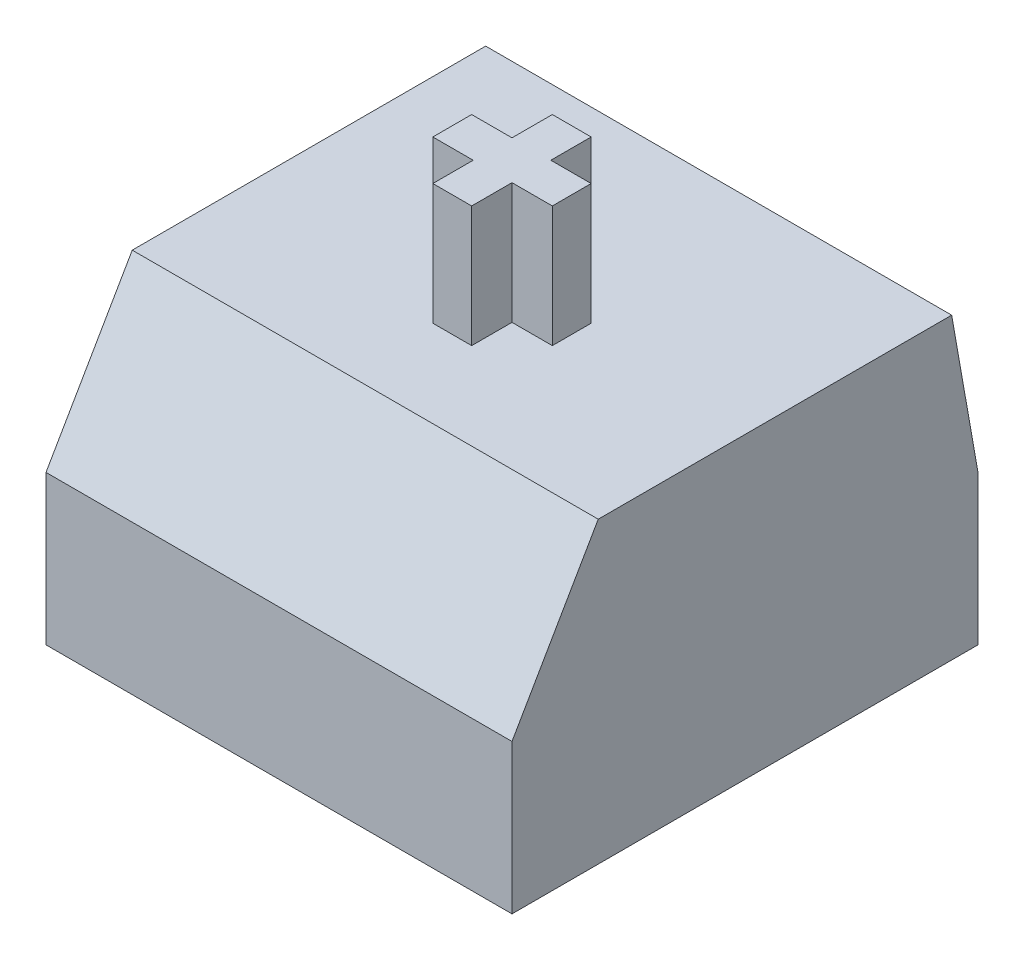
ISO-10303-21;
HEADER;
FILE_DESCRIPTION(('STEP AP214'),'2;1');
FILE_NAME('part.step','',(''),(''),'','','');
FILE_SCHEMA(('AUTOMOTIVE_DESIGN { 1 0 10303 214 1 1 1 1 }'));
ENDSEC;
DATA;
#1=APPLICATION_CONTEXT('core data for automotive mechanical design processes');
#2=APPLICATION_PROTOCOL_DEFINITION('international standard','automotive_design',2000,#1);
#3=PRODUCT_CONTEXT('',#1,'mechanical');
#4=PRODUCT('Part','Part','',(#3));
#5=PRODUCT_RELATED_PRODUCT_CATEGORY('part','',(#4));
#6=PRODUCT_DEFINITION_FORMATION('','',#4);
#7=PRODUCT_DEFINITION_CONTEXT('part definition',#1,'design');
#8=PRODUCT_DEFINITION('design','',#6,#7);
#9=PRODUCT_DEFINITION_SHAPE('','',#8);
#10=(LENGTH_UNIT() NAMED_UNIT(*) SI_UNIT(.MILLI.,.METRE.));
#11=(NAMED_UNIT(*) PLANE_ANGLE_UNIT() SI_UNIT($,.RADIAN.));
#12=(NAMED_UNIT(*) SI_UNIT($,.STERADIAN.) SOLID_ANGLE_UNIT());
#13=UNCERTAINTY_MEASURE_WITH_UNIT(LENGTH_MEASURE(1.E-05),#10,'distance_accuracy_value','');
#14=(GEOMETRIC_REPRESENTATION_CONTEXT(3) GLOBAL_UNCERTAINTY_ASSIGNED_CONTEXT((#13)) GLOBAL_UNIT_ASSIGNED_CONTEXT((#10,
#11,#12)) REPRESENTATION_CONTEXT('',''));
#15=CARTESIAN_POINT('',(0.,0.,0.));
#16=DIRECTION('',(0.,0.,1.));
#17=DIRECTION('',(1.,0.,0.));
#18=AXIS2_PLACEMENT_3D('',#15,#16,#17);
#19=CARTESIAN_POINT('',(7.8,10.,-6.91836509645765));
#20=DIRECTION('',(0.,-1.,0.));
#21=DIRECTION('',(0.,0.,-1.));
#22=AXIS2_PLACEMENT_3D('',#19,#20,#21);
#23=PLANE('',#22);
#24=DIRECTION('',(0.,0.,1.));
#25=VECTOR('',#24,1.);
#26=CARTESIAN_POINT('',(-7.8,10.,-6.91836509645765));
#27=LINE('',#26,#25);
#28=CARTESIAN_POINT('',(-7.8,10.,-6.91836509645765));
#29=VERTEX_POINT('',#28);
#30=CARTESIAN_POINT('',(-7.8,10.,4.91324865405184));
#31=VERTEX_POINT('',#30);
#32=EDGE_CURVE('E193',#29,#31,#27,.T.);
#33=ORIENTED_EDGE('',*,*,#32,.T.);
#34=DIRECTION('',(-1.,0.,0.));
#35=VECTOR('',#34,1.);
#36=CARTESIAN_POINT('',(7.8,10.,4.91324865405184));
#37=LINE('',#36,#35);
#38=CARTESIAN_POINT('',(7.8,10.,4.91324865405184));
#39=VERTEX_POINT('',#38);
#40=EDGE_CURVE('E225',#39,#31,#37,.T.);
#41=ORIENTED_EDGE('',*,*,#40,.F.);
#42=DIRECTION('',(0.,0.,1.));
#43=VECTOR('',#42,1.);
#44=CARTESIAN_POINT('',(7.8,10.,-6.91836509645765));
#45=LINE('',#44,#43);
#46=CARTESIAN_POINT('',(7.8,10.,-6.91836509645765));
#47=VERTEX_POINT('',#46);
#48=EDGE_CURVE('E204',#47,#39,#45,.T.);
#49=ORIENTED_EDGE('',*,*,#48,.F.);
#50=DIRECTION('',(-1.,0.,0.));
#51=VECTOR('',#50,1.);
#52=CARTESIAN_POINT('',(7.8,10.,-6.91836509645765));
#53=LINE('',#52,#51);
#54=EDGE_CURVE('E215',#47,#29,#53,.T.);
#55=ORIENTED_EDGE('',*,*,#54,.T.);
#56=EDGE_LOOP('',(#33,#41,#49,#55));
#57=FACE_BOUND('',#56,.T.);
#58=DIRECTION('',(0.,0.,1.));
#59=VECTOR('',#58,1.);
#60=CARTESIAN_POINT('',(-0.65,10.,-0.649999999999998));
#61=LINE('',#60,#59);
#62=CARTESIAN_POINT('',(-0.65,10.,-2.));
#63=VERTEX_POINT('',#62);
#64=CARTESIAN_POINT('',(-0.65,10.,-0.649999999999999));
#65=VERTEX_POINT('',#64);
#66=EDGE_CURVE('E191',#63,#65,#61,.T.);
#67=ORIENTED_EDGE('',*,*,#66,.F.);
#68=DIRECTION('',(-1.,0.,0.));
#69=VECTOR('',#68,1.);
#70=CARTESIAN_POINT('',(-0.65,10.,-2.));
#71=LINE('',#70,#69);
#72=CARTESIAN_POINT('',(0.65,10.,-2.));
#73=VERTEX_POINT('',#72);
#74=EDGE_CURVE('E188',#73,#63,#71,.T.);
#75=ORIENTED_EDGE('',*,*,#74,.F.);
#76=DIRECTION('',(0.,0.,-1.));
#77=VECTOR('',#76,1.);
#78=CARTESIAN_POINT('',(0.65,10.,-2.));
#79=LINE('',#78,#77);
#80=CARTESIAN_POINT('',(0.65,10.,-0.649999999999998));
#81=VERTEX_POINT('',#80);
#82=EDGE_CURVE('E680',#81,#73,#79,.T.);
#83=ORIENTED_EDGE('',*,*,#82,.F.);
#84=DIRECTION('',(-1.,0.,0.));
#85=VECTOR('',#84,1.);
#86=CARTESIAN_POINT('',(0.650000000000001,10.,-0.649999999999999));
#87=LINE('',#86,#85);
#88=CARTESIAN_POINT('',(2.,10.,-0.649999999999998));
#89=VERTEX_POINT('',#88);
#90=EDGE_CURVE('E676',#89,#81,#87,.T.);
#91=ORIENTED_EDGE('',*,*,#90,.F.);
#92=DIRECTION('',(0.,0.,-1.));
#93=VECTOR('',#92,1.);
#94=CARTESIAN_POINT('',(2.,10.,-0.649999999999998));
#95=LINE('',#94,#93);
#96=CARTESIAN_POINT('',(2.,10.,0.650000000000003));
#97=VERTEX_POINT('',#96);
#98=EDGE_CURVE('E672',#97,#89,#95,.T.);
#99=ORIENTED_EDGE('',*,*,#98,.F.);
#100=DIRECTION('',(1.,0.,0.));
#101=VECTOR('',#100,1.);
#102=CARTESIAN_POINT('',(2.,10.,0.650000000000002));
#103=LINE('',#102,#101);
#104=CARTESIAN_POINT('',(0.650000000000001,10.,0.650000000000002));
#105=VERTEX_POINT('',#104);
#106=EDGE_CURVE('E668',#105,#97,#103,.T.);
#107=ORIENTED_EDGE('',*,*,#106,.F.);
#108=DIRECTION('',(0.,0.,-1.));
#109=VECTOR('',#108,1.);
#110=CARTESIAN_POINT('',(0.650000000000001,10.,0.650000000000002));
#111=LINE('',#110,#109);
#112=CARTESIAN_POINT('',(0.650000000000002,10.,2.));
#113=VERTEX_POINT('',#112);
#114=EDGE_CURVE('E664',#113,#105,#111,.T.);
#115=ORIENTED_EDGE('',*,*,#114,.F.);
#116=DIRECTION('',(1.,0.,0.));
#117=VECTOR('',#116,1.);
#118=CARTESIAN_POINT('',(0.650000000000002,10.,2.));
#119=LINE('',#118,#117);
#120=CARTESIAN_POINT('',(-0.65,10.,2.));
#121=VERTEX_POINT('',#120);
#122=EDGE_CURVE('E660',#121,#113,#119,.T.);
#123=ORIENTED_EDGE('',*,*,#122,.F.);
#124=DIRECTION('',(0.,0.,1.));
#125=VECTOR('',#124,1.);
#126=CARTESIAN_POINT('',(-0.65,10.,2.));
#127=LINE('',#126,#125);
#128=CARTESIAN_POINT('',(-0.65,10.,0.650000000000001));
#129=VERTEX_POINT('',#128);
#130=EDGE_CURVE('E656',#129,#121,#127,.T.);
#131=ORIENTED_EDGE('',*,*,#130,.F.);
#132=DIRECTION('',(1.,0.,0.));
#133=VECTOR('',#132,1.);
#134=CARTESIAN_POINT('',(-0.65,10.,0.650000000000002));
#135=LINE('',#134,#133);
#136=CARTESIAN_POINT('',(-2.,10.,0.650000000000003));
#137=VERTEX_POINT('',#136);
#138=EDGE_CURVE('E652',#137,#129,#135,.T.);
#139=ORIENTED_EDGE('',*,*,#138,.F.);
#140=DIRECTION('',(0.,0.,1.));
#141=VECTOR('',#140,1.);
#142=CARTESIAN_POINT('',(-2.,10.,0.650000000000002));
#143=LINE('',#142,#141);
#144=CARTESIAN_POINT('',(-2.,10.,-0.649999999999999));
#145=VERTEX_POINT('',#144);
#146=EDGE_CURVE('E64',#145,#137,#143,.T.);
#147=ORIENTED_EDGE('',*,*,#146,.F.);
#148=DIRECTION('',(-1.,0.,0.));
#149=VECTOR('',#148,1.);
#150=CARTESIAN_POINT('',(-2.,10.,-0.649999999999998));
#151=LINE('',#150,#149);
#152=EDGE_CURVE('E59',#65,#145,#151,.T.);
#153=ORIENTED_EDGE('',*,*,#152,.F.);
#154=EDGE_LOOP('',(#67,#75,#83,#91,#99,#107,#115,#123,#131,#139,#147,#153));
#155=FACE_BOUND('',#154,.T.);
#156=ADVANCED_FACE('F43',(#57,#155),#23,.F.);
#157=CARTESIAN_POINT('',(-7.8,5.,-7.8));
#158=DIRECTION('',(1.,0.,0.));
#159=DIRECTION('',(0.,0.,-1.));
#160=AXIS2_PLACEMENT_3D('',#157,#158,#159);
#161=PLANE('',#160);
#162=DIRECTION('',(0.,0.,1.));
#163=VECTOR('',#162,1.);
#164=CARTESIAN_POINT('',(-7.8,0.,-7.8));
#165=LINE('',#164,#163);
#166=CARTESIAN_POINT('',(-7.8,0.,-7.8));
#167=VERTEX_POINT('',#166);
#168=CARTESIAN_POINT('',(-7.8,0.,7.8));
#169=VERTEX_POINT('',#168);
#170=EDGE_CURVE('E229',#167,#169,#165,.T.);
#171=ORIENTED_EDGE('',*,*,#170,.T.);
#172=DIRECTION('',(0.,-1.,0.));
#173=VECTOR('',#172,1.);
#174=CARTESIAN_POINT('',(-7.8,5.,7.8));
#175=LINE('',#174,#173);
#176=CARTESIAN_POINT('',(-7.8,5.,7.8));
#177=VERTEX_POINT('',#176);
#178=EDGE_CURVE('E11',#177,#169,#175,.T.);
#179=ORIENTED_EDGE('',*,*,#178,.F.);
#180=DIRECTION('',(0.,-0.866025403784436,0.500000000000004));
#181=VECTOR('',#180,1.);
#182=CARTESIAN_POINT('',(-7.8,10.,4.91324865405184));
#183=LINE('',#182,#181);
#184=EDGE_CURVE('E198',#31,#177,#183,.T.);
#185=ORIENTED_EDGE('',*,*,#184,.F.);
#186=ORIENTED_EDGE('',*,*,#32,.F.);
#187=DIRECTION('',(0.,0.984807753012207,0.173648177666935));
#188=VECTOR('',#187,1.);
#189=CARTESIAN_POINT('',(-7.8,5.,-7.8));
#190=LINE('',#189,#188);
#191=CARTESIAN_POINT('',(-7.8,5.,-7.8));
#192=VERTEX_POINT('',#191);
#193=EDGE_CURVE('E209',#192,#29,#190,.T.);
#194=ORIENTED_EDGE('',*,*,#193,.F.);
#195=DIRECTION('',(0.,-1.,0.));
#196=VECTOR('',#195,1.);
#197=CARTESIAN_POINT('',(-7.8,5.,-7.8));
#198=LINE('',#197,#196);
#199=EDGE_CURVE('E239',#192,#167,#198,.T.);
#200=ORIENTED_EDGE('',*,*,#199,.T.);
#201=EDGE_LOOP('',(#171,#179,#185,#186,#194,#200));
#202=FACE_BOUND('',#201,.T.);
#203=ADVANCED_FACE('F45',(#202),#161,.F.);
#204=CARTESIAN_POINT('',(-7.8,5.,7.8));
#205=DIRECTION('',(0.,0.,-1.));
#206=DIRECTION('',(-1.,0.,0.));
#207=AXIS2_PLACEMENT_3D('',#204,#205,#206);
#208=PLANE('',#207);
#209=DIRECTION('',(1.,0.,0.));
#210=VECTOR('',#209,1.);
#211=CARTESIAN_POINT('',(-7.8,0.,7.8));
#212=LINE('',#211,#210);
#213=CARTESIAN_POINT('',(7.8,0.,7.8));
#214=VERTEX_POINT('',#213);
#215=EDGE_CURVE('E243',#169,#214,#212,.T.);
#216=ORIENTED_EDGE('',*,*,#215,.T.);
#217=DIRECTION('',(0.,-1.,0.));
#218=VECTOR('',#217,1.);
#219=CARTESIAN_POINT('',(7.8,5.,7.8));
#220=LINE('',#219,#218);
#221=CARTESIAN_POINT('',(7.8,5.,7.8));
#222=VERTEX_POINT('',#221);
#223=EDGE_CURVE('E52',#222,#214,#220,.T.);
#224=ORIENTED_EDGE('',*,*,#223,.F.);
#225=DIRECTION('',(1.,0.,0.));
#226=VECTOR('',#225,1.);
#227=CARTESIAN_POINT('',(-7.8,5.,7.8));
#228=LINE('',#227,#226);
#229=EDGE_CURVE('E230',#177,#222,#228,.T.);
#230=ORIENTED_EDGE('',*,*,#229,.F.);
#231=ORIENTED_EDGE('',*,*,#178,.T.);
#232=EDGE_LOOP('',(#216,#224,#230,#231));
#233=FACE_BOUND('',#232,.T.);
#234=ADVANCED_FACE('F283',(#233),#208,.F.);
#235=CARTESIAN_POINT('',(7.8,5.,-7.8));
#236=DIRECTION('',(-1.,0.,0.));
#237=DIRECTION('',(0.,0.,1.));
#238=AXIS2_PLACEMENT_3D('',#235,#236,#237);
#239=PLANE('',#238);
#240=DIRECTION('',(0.,0.,-1.));
#241=VECTOR('',#240,1.);
#242=CARTESIAN_POINT('',(7.8,0.,-7.8));
#243=LINE('',#242,#241);
#244=CARTESIAN_POINT('',(7.8,0.,-7.8));
#245=VERTEX_POINT('',#244);
#246=EDGE_CURVE('E246',#214,#245,#243,.T.);
#247=ORIENTED_EDGE('',*,*,#246,.T.);
#248=DIRECTION('',(0.,-1.,0.));
#249=VECTOR('',#248,1.);
#250=CARTESIAN_POINT('',(7.8,5.,-7.8));
#251=LINE('',#250,#249);
#252=CARTESIAN_POINT('',(7.8,5.,-7.8));
#253=VERTEX_POINT('',#252);
#254=EDGE_CURVE('E254',#253,#245,#251,.T.);
#255=ORIENTED_EDGE('',*,*,#254,.F.);
#256=DIRECTION('',(0.,0.984807753012207,0.173648177666935));
#257=VECTOR('',#256,1.);
#258=CARTESIAN_POINT('',(7.8,5.,-7.8));
#259=LINE('',#258,#257);
#260=EDGE_CURVE('E213',#253,#47,#259,.T.);
#261=ORIENTED_EDGE('',*,*,#260,.T.);
#262=ORIENTED_EDGE('',*,*,#48,.T.);
#263=DIRECTION('',(0.,-0.866025403784436,0.500000000000004));
#264=VECTOR('',#263,1.);
#265=CARTESIAN_POINT('',(7.8,10.,4.91324865405184));
#266=LINE('',#265,#264);
#267=EDGE_CURVE('E208',#39,#222,#266,.T.);
#268=ORIENTED_EDGE('',*,*,#267,.T.);
#269=ORIENTED_EDGE('',*,*,#223,.T.);
#270=EDGE_LOOP('',(#247,#255,#261,#262,#268,#269));
#271=FACE_BOUND('',#270,.T.);
#272=ADVANCED_FACE('F261',(#271),#239,.F.);
#273=CARTESIAN_POINT('',(-7.8,5.,-7.8));
#274=DIRECTION('',(0.,0.,1.));
#275=DIRECTION('',(1.,0.,0.));
#276=AXIS2_PLACEMENT_3D('',#273,#274,#275);
#277=PLANE('',#276);
#278=DIRECTION('',(-1.,0.,0.));
#279=VECTOR('',#278,1.);
#280=CARTESIAN_POINT('',(-7.8,0.,-7.8));
#281=LINE('',#280,#279);
#282=EDGE_CURVE('E235',#245,#167,#281,.T.);
#283=ORIENTED_EDGE('',*,*,#282,.T.);
#284=ORIENTED_EDGE('',*,*,#199,.F.);
#285=DIRECTION('',(-1.,0.,0.));
#286=VECTOR('',#285,1.);
#287=CARTESIAN_POINT('',(-7.8,5.,-7.8));
#288=LINE('',#287,#286);
#289=EDGE_CURVE('E234',#253,#192,#288,.T.);
#290=ORIENTED_EDGE('',*,*,#289,.F.);
#291=ORIENTED_EDGE('',*,*,#254,.T.);
#292=EDGE_LOOP('',(#283,#284,#290,#291));
#293=FACE_BOUND('',#292,.T.);
#294=ADVANCED_FACE('F268',(#293),#277,.F.);
#295=CARTESIAN_POINT('',(0.,0.,0.));
#296=DIRECTION('',(0.,1.,0.));
#297=DIRECTION('',(0.,0.,1.));
#298=AXIS2_PLACEMENT_3D('',#295,#296,#297);
#299=PLANE('',#298);
#300=CARTESIAN_POINT('',(-3.81,0.,-2.54));
#301=DIRECTION('',(0.,1.,0.));
#302=DIRECTION('',(0.,0.,1.));
#303=AXIS2_PLACEMENT_3D('',#300,#301,#302);
#304=CIRCLE('',#303,0.65);
#305=CARTESIAN_POINT('',(-3.81,0.,-1.89));
#306=VERTEX_POINT('',#305);
#307=EDGE_CURVE('E595',#306,#306,#304,.T.);
#308=ORIENTED_EDGE('',*,*,#307,.T.);
#309=EDGE_LOOP('',(#308));
#310=FACE_BOUND('',#309,.T.);
#311=CARTESIAN_POINT('',(2.54,0.,-5.08));
#312=DIRECTION('',(0.,1.,0.));
#313=DIRECTION('',(0.,0.,1.));
#314=AXIS2_PLACEMENT_3D('',#311,#312,#313);
#315=CIRCLE('',#314,0.65);
#316=CARTESIAN_POINT('',(2.54,0.,-4.43));
#317=VERTEX_POINT('',#316);
#318=EDGE_CURVE('E599',#317,#317,#315,.T.);
#319=ORIENTED_EDGE('',*,*,#318,.T.);
#320=EDGE_LOOP('',(#319));
#321=FACE_BOUND('',#320,.T.);
#322=CARTESIAN_POINT('',(0.,0.,0.));
#323=DIRECTION('',(0.,1.,0.));
#324=DIRECTION('',(0.,0.,1.));
#325=AXIS2_PLACEMENT_3D('',#322,#323,#324);
#326=CIRCLE('',#325,1.925);
#327=CARTESIAN_POINT('',(0.,0.,1.925));
#328=VERTEX_POINT('',#327);
#329=EDGE_CURVE('E606',#328,#328,#326,.T.);
#330=ORIENTED_EDGE('',*,*,#329,.T.);
#331=EDGE_LOOP('',(#330));
#332=FACE_BOUND('',#331,.T.);
#333=ORIENTED_EDGE('',*,*,#170,.F.);
#334=ORIENTED_EDGE('',*,*,#282,.F.);
#335=ORIENTED_EDGE('',*,*,#246,.F.);
#336=ORIENTED_EDGE('',*,*,#215,.F.);
#337=EDGE_LOOP('',(#333,#334,#335,#336));
#338=FACE_BOUND('',#337,.T.);
#339=ADVANCED_FACE('F266',(#310,#321,#332,#338),#299,.F.);
#340=CARTESIAN_POINT('',(7.8,10.,4.91324865405184));
#341=DIRECTION('',(0.,-0.500000000000004,-0.866025403784436));
#342=DIRECTION('',(0.,0.866025403784436,-0.500000000000004));
#343=AXIS2_PLACEMENT_3D('',#340,#341,#342);
#344=PLANE('',#343);
#345=ORIENTED_EDGE('',*,*,#184,.T.);
#346=ORIENTED_EDGE('',*,*,#229,.T.);
#347=ORIENTED_EDGE('',*,*,#267,.F.);
#348=ORIENTED_EDGE('',*,*,#40,.T.);
#349=EDGE_LOOP('',(#345,#346,#347,#348));
#350=FACE_BOUND('',#349,.T.);
#351=ADVANCED_FACE('F282',(#350),#344,.F.);
#352=CARTESIAN_POINT('',(7.8,5.,-7.8));
#353=DIRECTION('',(0.,-0.173648177666935,0.984807753012207));
#354=DIRECTION('',(0.,-0.984807753012207,-0.173648177666935));
#355=AXIS2_PLACEMENT_3D('',#352,#353,#354);
#356=PLANE('',#355);
#357=ORIENTED_EDGE('',*,*,#193,.T.);
#358=ORIENTED_EDGE('',*,*,#54,.F.);
#359=ORIENTED_EDGE('',*,*,#260,.F.);
#360=ORIENTED_EDGE('',*,*,#289,.T.);
#361=EDGE_LOOP('',(#357,#358,#359,#360));
#362=FACE_BOUND('',#361,.T.);
#363=ADVANCED_FACE('F276',(#362),#356,.F.);
#364=CARTESIAN_POINT('',(-0.65,14.05,-0.649999999999998));
#365=DIRECTION('',(1.,0.,0.));
#366=DIRECTION('',(0.,0.,-1.));
#367=AXIS2_PLACEMENT_3D('',#364,#365,#366);
#368=PLANE('',#367);
#369=ORIENTED_EDGE('',*,*,#66,.T.);
#370=DIRECTION('',(0.,-1.,0.));
#371=VECTOR('',#370,1.);
#372=CARTESIAN_POINT('',(-0.65,14.05,-0.649999999999998));
#373=LINE('',#372,#371);
#374=CARTESIAN_POINT('',(-0.65,14.05,-0.649999999999998));
#375=VERTEX_POINT('',#374);
#376=EDGE_CURVE('E170',#375,#65,#373,.T.);
#377=ORIENTED_EDGE('',*,*,#376,.F.);
#378=DIRECTION('',(0.,0.,1.));
#379=VECTOR('',#378,1.);
#380=CARTESIAN_POINT('',(-0.65,14.05,-0.649999999999998));
#381=LINE('',#380,#379);
#382=CARTESIAN_POINT('',(-0.65,14.05,-2.));
#383=VERTEX_POINT('',#382);
#384=EDGE_CURVE('E178',#383,#375,#381,.T.);
#385=ORIENTED_EDGE('',*,*,#384,.F.);
#386=DIRECTION('',(0.,-1.,0.));
#387=VECTOR('',#386,1.);
#388=CARTESIAN_POINT('',(-0.65,14.05,-2.));
#389=LINE('',#388,#387);
#390=EDGE_CURVE('E645',#383,#63,#389,.T.);
#391=ORIENTED_EDGE('',*,*,#390,.T.);
#392=EDGE_LOOP('',(#369,#377,#385,#391));
#393=FACE_BOUND('',#392,.T.);
#394=ADVANCED_FACE('F190',(#393),#368,.F.);
#395=CARTESIAN_POINT('',(-2.,14.05,-0.649999999999998));
#396=DIRECTION('',(0.,0.,1.));
#397=DIRECTION('',(0.,-1.,0.));
#398=AXIS2_PLACEMENT_3D('',#395,#396,#397);
#399=PLANE('',#398);
#400=ORIENTED_EDGE('',*,*,#152,.T.);
#401=DIRECTION('',(0.,-1.,0.));
#402=VECTOR('',#401,1.);
#403=CARTESIAN_POINT('',(-2.,14.05,-0.649999999999998));
#404=LINE('',#403,#402);
#405=CARTESIAN_POINT('',(-2.,14.05,-0.649999999999998));
#406=VERTEX_POINT('',#405);
#407=EDGE_CURVE('E173',#406,#145,#404,.T.);
#408=ORIENTED_EDGE('',*,*,#407,.F.);
#409=DIRECTION('',(-1.,0.,0.));
#410=VECTOR('',#409,1.);
#411=CARTESIAN_POINT('',(-2.,14.05,-0.649999999999998));
#412=LINE('',#411,#410);
#413=EDGE_CURVE('E166',#375,#406,#412,.T.);
#414=ORIENTED_EDGE('',*,*,#413,.F.);
#415=ORIENTED_EDGE('',*,*,#376,.T.);
#416=EDGE_LOOP('',(#400,#408,#414,#415));
#417=FACE_BOUND('',#416,.T.);
#418=ADVANCED_FACE('F168',(#417),#399,.F.);
#419=CARTESIAN_POINT('',(-2.,14.05,0.650000000000003));
#420=DIRECTION('',(1.,0.,0.));
#421=DIRECTION('',(0.,0.,-1.));
#422=AXIS2_PLACEMENT_3D('',#419,#420,#421);
#423=PLANE('',#422);
#424=ORIENTED_EDGE('',*,*,#146,.T.);
#425=DIRECTION('',(0.,-1.,0.));
#426=VECTOR('',#425,1.);
#427=CARTESIAN_POINT('',(-2.,14.05,0.650000000000003));
#428=LINE('',#427,#426);
#429=CARTESIAN_POINT('',(-2.,14.05,0.650000000000003));
#430=VERTEX_POINT('',#429);
#431=EDGE_CURVE('E200',#430,#137,#428,.T.);
#432=ORIENTED_EDGE('',*,*,#431,.F.);
#433=DIRECTION('',(0.,0.,1.));
#434=VECTOR('',#433,1.);
#435=CARTESIAN_POINT('',(-2.,14.05,0.650000000000003));
#436=LINE('',#435,#434);
#437=EDGE_CURVE('E177',#406,#430,#436,.T.);
#438=ORIENTED_EDGE('',*,*,#437,.F.);
#439=ORIENTED_EDGE('',*,*,#407,.T.);
#440=EDGE_LOOP('',(#424,#432,#438,#439));
#441=FACE_BOUND('',#440,.T.);
#442=ADVANCED_FACE('F333',(#441),#423,.F.);
#443=CARTESIAN_POINT('',(-0.65,14.05,0.650000000000003));
#444=DIRECTION('',(0.,0.,-1.));
#445=DIRECTION('',(-1.,0.,0.));
#446=AXIS2_PLACEMENT_3D('',#443,#444,#445);
#447=PLANE('',#446);
#448=ORIENTED_EDGE('',*,*,#138,.T.);
#449=DIRECTION('',(0.,-1.,0.));
#450=VECTOR('',#449,1.);
#451=CARTESIAN_POINT('',(-0.65,14.05,0.650000000000003));
#452=LINE('',#451,#450);
#453=CARTESIAN_POINT('',(-0.65,14.05,0.650000000000003));
#454=VERTEX_POINT('',#453);
#455=EDGE_CURVE('E717',#454,#129,#452,.T.);
#456=ORIENTED_EDGE('',*,*,#455,.F.);
#457=DIRECTION('',(1.,0.,0.));
#458=VECTOR('',#457,1.);
#459=CARTESIAN_POINT('',(-0.65,14.05,0.650000000000003));
#460=LINE('',#459,#458);
#461=EDGE_CURVE('E619',#430,#454,#460,.T.);
#462=ORIENTED_EDGE('',*,*,#461,.F.);
#463=ORIENTED_EDGE('',*,*,#431,.T.);
#464=EDGE_LOOP('',(#448,#456,#462,#463));
#465=FACE_BOUND('',#464,.T.);
#466=ADVANCED_FACE('F340',(#465),#447,.F.);
#467=CARTESIAN_POINT('',(-0.65,14.05,2.));
#468=DIRECTION('',(1.,0.,0.));
#469=DIRECTION('',(0.,0.,-1.));
#470=AXIS2_PLACEMENT_3D('',#467,#468,#469);
#471=PLANE('',#470);
#472=ORIENTED_EDGE('',*,*,#130,.T.);
#473=DIRECTION('',(0.,-1.,0.));
#474=VECTOR('',#473,1.);
#475=CARTESIAN_POINT('',(-0.65,14.05,2.));
#476=LINE('',#475,#474);
#477=CARTESIAN_POINT('',(-0.65,14.05,2.));
#478=VERTEX_POINT('',#477);
#479=EDGE_CURVE('E713',#478,#121,#476,.T.);
#480=ORIENTED_EDGE('',*,*,#479,.F.);
#481=DIRECTION('',(0.,0.,1.));
#482=VECTOR('',#481,1.);
#483=CARTESIAN_POINT('',(-0.65,14.05,2.));
#484=LINE('',#483,#482);
#485=EDGE_CURVE('E622',#454,#478,#484,.T.);
#486=ORIENTED_EDGE('',*,*,#485,.F.);
#487=ORIENTED_EDGE('',*,*,#455,.T.);
#488=EDGE_LOOP('',(#472,#480,#486,#487));
#489=FACE_BOUND('',#488,.T.);
#490=ADVANCED_FACE('F348',(#489),#471,.F.);
#491=CARTESIAN_POINT('',(0.650000000000002,14.05,2.));
#492=DIRECTION('',(0.,0.,-1.));
#493=DIRECTION('',(-1.,0.,0.));
#494=AXIS2_PLACEMENT_3D('',#491,#492,#493);
#495=PLANE('',#494);
#496=ORIENTED_EDGE('',*,*,#122,.T.);
#497=DIRECTION('',(0.,-1.,0.));
#498=VECTOR('',#497,1.);
#499=CARTESIAN_POINT('',(0.650000000000002,14.05,2.));
#500=LINE('',#499,#498);
#501=CARTESIAN_POINT('',(0.650000000000002,14.05,2.));
#502=VERTEX_POINT('',#501);
#503=EDGE_CURVE('E709',#502,#113,#500,.T.);
#504=ORIENTED_EDGE('',*,*,#503,.F.);
#505=DIRECTION('',(1.,0.,0.));
#506=VECTOR('',#505,1.);
#507=CARTESIAN_POINT('',(0.650000000000002,14.05,2.));
#508=LINE('',#507,#506);
#509=EDGE_CURVE('E625',#478,#502,#508,.T.);
#510=ORIENTED_EDGE('',*,*,#509,.F.);
#511=ORIENTED_EDGE('',*,*,#479,.T.);
#512=EDGE_LOOP('',(#496,#504,#510,#511));
#513=FACE_BOUND('',#512,.T.);
#514=ADVANCED_FACE('F356',(#513),#495,.F.);
#515=CARTESIAN_POINT('',(0.650000000000001,14.05,0.650000000000002));
#516=DIRECTION('',(-1.,0.,0.));
#517=DIRECTION('',(0.,0.,1.));
#518=AXIS2_PLACEMENT_3D('',#515,#516,#517);
#519=PLANE('',#518);
#520=ORIENTED_EDGE('',*,*,#114,.T.);
#521=DIRECTION('',(0.,-1.,0.));
#522=VECTOR('',#521,1.);
#523=CARTESIAN_POINT('',(0.650000000000001,14.05,0.650000000000002));
#524=LINE('',#523,#522);
#525=CARTESIAN_POINT('',(0.650000000000001,14.05,0.650000000000002));
#526=VERTEX_POINT('',#525);
#527=EDGE_CURVE('E705',#526,#105,#524,.T.);
#528=ORIENTED_EDGE('',*,*,#527,.F.);
#529=DIRECTION('',(0.,0.,-1.));
#530=VECTOR('',#529,1.);
#531=CARTESIAN_POINT('',(0.650000000000001,14.05,0.650000000000002));
#532=LINE('',#531,#530);
#533=EDGE_CURVE('E628',#502,#526,#532,.T.);
#534=ORIENTED_EDGE('',*,*,#533,.F.);
#535=ORIENTED_EDGE('',*,*,#503,.T.);
#536=EDGE_LOOP('',(#520,#528,#534,#535));
#537=FACE_BOUND('',#536,.T.);
#538=ADVANCED_FACE('F364',(#537),#519,.F.);
#539=CARTESIAN_POINT('',(2.,14.05,0.650000000000002));
#540=DIRECTION('',(0.,0.,-1.));
#541=DIRECTION('',(0.,1.,0.));
#542=AXIS2_PLACEMENT_3D('',#539,#540,#541);
#543=PLANE('',#542);
#544=ORIENTED_EDGE('',*,*,#106,.T.);
#545=DIRECTION('',(0.,-1.,0.));
#546=VECTOR('',#545,1.);
#547=CARTESIAN_POINT('',(2.,14.05,0.650000000000002));
#548=LINE('',#547,#546);
#549=CARTESIAN_POINT('',(2.,14.05,0.650000000000002));
#550=VERTEX_POINT('',#549);
#551=EDGE_CURVE('E701',#550,#97,#548,.T.);
#552=ORIENTED_EDGE('',*,*,#551,.F.);
#553=DIRECTION('',(1.,0.,0.));
#554=VECTOR('',#553,1.);
#555=CARTESIAN_POINT('',(2.,14.05,0.650000000000002));
#556=LINE('',#555,#554);
#557=EDGE_CURVE('E631',#526,#550,#556,.T.);
#558=ORIENTED_EDGE('',*,*,#557,.F.);
#559=ORIENTED_EDGE('',*,*,#527,.T.);
#560=EDGE_LOOP('',(#544,#552,#558,#559));
#561=FACE_BOUND('',#560,.T.);
#562=ADVANCED_FACE('F372',(#561),#543,.F.);
#563=CARTESIAN_POINT('',(2.,14.05,-0.649999999999998));
#564=DIRECTION('',(-1.,0.,0.));
#565=DIRECTION('',(0.,0.,1.));
#566=AXIS2_PLACEMENT_3D('',#563,#564,#565);
#567=PLANE('',#566);
#568=ORIENTED_EDGE('',*,*,#98,.T.);
#569=DIRECTION('',(0.,-1.,0.));
#570=VECTOR('',#569,1.);
#571=CARTESIAN_POINT('',(2.,14.05,-0.649999999999998));
#572=LINE('',#571,#570);
#573=CARTESIAN_POINT('',(2.,14.05,-0.649999999999998));
#574=VERTEX_POINT('',#573);
#575=EDGE_CURVE('E697',#574,#89,#572,.T.);
#576=ORIENTED_EDGE('',*,*,#575,.F.);
#577=DIRECTION('',(0.,0.,-1.));
#578=VECTOR('',#577,1.);
#579=CARTESIAN_POINT('',(2.,14.05,-0.649999999999998));
#580=LINE('',#579,#578);
#581=EDGE_CURVE('E634',#550,#574,#580,.T.);
#582=ORIENTED_EDGE('',*,*,#581,.F.);
#583=ORIENTED_EDGE('',*,*,#551,.T.);
#584=EDGE_LOOP('',(#568,#576,#582,#583));
#585=FACE_BOUND('',#584,.T.);
#586=ADVANCED_FACE('F380',(#585),#567,.F.);
#587=CARTESIAN_POINT('',(0.650000000000001,14.05,-0.649999999999998));
#588=DIRECTION('',(0.,0.,1.));
#589=DIRECTION('',(1.,0.,0.));
#590=AXIS2_PLACEMENT_3D('',#587,#588,#589);
#591=PLANE('',#590);
#592=ORIENTED_EDGE('',*,*,#90,.T.);
#593=DIRECTION('',(0.,-1.,0.));
#594=VECTOR('',#593,1.);
#595=CARTESIAN_POINT('',(0.650000000000001,14.05,-0.649999999999998));
#596=LINE('',#595,#594);
#597=CARTESIAN_POINT('',(0.650000000000001,14.05,-0.649999999999998));
#598=VERTEX_POINT('',#597);
#599=EDGE_CURVE('E693',#598,#81,#596,.T.);
#600=ORIENTED_EDGE('',*,*,#599,.F.);
#601=DIRECTION('',(-1.,0.,0.));
#602=VECTOR('',#601,1.);
#603=CARTESIAN_POINT('',(0.650000000000001,14.05,-0.649999999999998));
#604=LINE('',#603,#602);
#605=EDGE_CURVE('E637',#574,#598,#604,.T.);
#606=ORIENTED_EDGE('',*,*,#605,.F.);
#607=ORIENTED_EDGE('',*,*,#575,.T.);
#608=EDGE_LOOP('',(#592,#600,#606,#607));
#609=FACE_BOUND('',#608,.T.);
#610=ADVANCED_FACE('F388',(#609),#591,.F.);
#611=CARTESIAN_POINT('',(0.65,14.05,-2.));
#612=DIRECTION('',(-1.,0.,0.));
#613=DIRECTION('',(0.,0.,1.));
#614=AXIS2_PLACEMENT_3D('',#611,#612,#613);
#615=PLANE('',#614);
#616=ORIENTED_EDGE('',*,*,#82,.T.);
#617=DIRECTION('',(0.,-1.,0.));
#618=VECTOR('',#617,1.);
#619=CARTESIAN_POINT('',(0.65,14.05,-2.));
#620=LINE('',#619,#618);
#621=CARTESIAN_POINT('',(0.65,14.05,-2.));
#622=VERTEX_POINT('',#621);
#623=EDGE_CURVE('E689',#622,#73,#620,.T.);
#624=ORIENTED_EDGE('',*,*,#623,.F.);
#625=DIRECTION('',(0.,0.,-1.));
#626=VECTOR('',#625,1.);
#627=CARTESIAN_POINT('',(0.65,14.05,-2.));
#628=LINE('',#627,#626);
#629=EDGE_CURVE('E640',#598,#622,#628,.T.);
#630=ORIENTED_EDGE('',*,*,#629,.F.);
#631=ORIENTED_EDGE('',*,*,#599,.T.);
#632=EDGE_LOOP('',(#616,#624,#630,#631));
#633=FACE_BOUND('',#632,.T.);
#634=ADVANCED_FACE('F396',(#633),#615,.F.);
#635=CARTESIAN_POINT('',(-0.65,14.05,-2.));
#636=DIRECTION('',(0.,0.,1.));
#637=DIRECTION('',(1.,0.,0.));
#638=AXIS2_PLACEMENT_3D('',#635,#636,#637);
#639=PLANE('',#638);
#640=ORIENTED_EDGE('',*,*,#74,.T.);
#641=ORIENTED_EDGE('',*,*,#390,.F.);
#642=DIRECTION('',(-1.,0.,0.));
#643=VECTOR('',#642,1.);
#644=CARTESIAN_POINT('',(-0.65,14.05,-2.));
#645=LINE('',#644,#643);
#646=EDGE_CURVE('E183',#622,#383,#645,.T.);
#647=ORIENTED_EDGE('',*,*,#646,.F.);
#648=ORIENTED_EDGE('',*,*,#623,.T.);
#649=EDGE_LOOP('',(#640,#641,#647,#648));
#650=FACE_BOUND('',#649,.T.);
#651=ADVANCED_FACE('F404',(#650),#639,.F.);
#652=CARTESIAN_POINT('',(0.,14.05,0.));
#653=DIRECTION('',(0.,-1.,0.));
#654=DIRECTION('',(0.,0.,-1.));
#655=AXIS2_PLACEMENT_3D('',#652,#653,#654);
#656=PLANE('',#655);
#657=ORIENTED_EDGE('',*,*,#384,.T.);
#658=ORIENTED_EDGE('',*,*,#413,.T.);
#659=ORIENTED_EDGE('',*,*,#437,.T.);
#660=ORIENTED_EDGE('',*,*,#461,.T.);
#661=ORIENTED_EDGE('',*,*,#485,.T.);
#662=ORIENTED_EDGE('',*,*,#509,.T.);
#663=ORIENTED_EDGE('',*,*,#533,.T.);
#664=ORIENTED_EDGE('',*,*,#557,.T.);
#665=ORIENTED_EDGE('',*,*,#581,.T.);
#666=ORIENTED_EDGE('',*,*,#605,.T.);
#667=ORIENTED_EDGE('',*,*,#629,.T.);
#668=ORIENTED_EDGE('',*,*,#646,.T.);
#669=EDGE_LOOP('',(#657,#658,#659,#660,#661,#662,#663,#664,#665,#666,#667,#668));
#670=FACE_BOUND('',#669,.T.);
#671=ADVANCED_FACE('F181',(#670),#656,.F.);
#672=CARTESIAN_POINT('',(0.,-3.,0.));
#673=DIRECTION('',(0.,1.,0.));
#674=DIRECTION('',(0.,0.,1.));
#675=AXIS2_PLACEMENT_3D('',#672,#673,#674);
#676=CYLINDRICAL_SURFACE('',#675,1.925);
#677=CARTESIAN_POINT('',(0.,-3.,0.));
#678=DIRECTION('',(0.,1.,0.));
#679=DIRECTION('',(0.,0.,1.));
#680=AXIS2_PLACEMENT_3D('',#677,#678,#679);
#681=CIRCLE('',#680,1.925);
#682=CARTESIAN_POINT('',(0.,-3.,1.925));
#683=VERTEX_POINT('',#682);
#684=EDGE_CURVE('E610',#683,#683,#681,.T.);
#685=ORIENTED_EDGE('',*,*,#684,.T.);
#686=EDGE_LOOP('',(#685));
#687=FACE_BOUND('',#686,.T.);
#688=ORIENTED_EDGE('',*,*,#329,.F.);
#689=EDGE_LOOP('',(#688));
#690=FACE_BOUND('',#689,.T.);
#691=ADVANCED_FACE('F419',(#687,#690),#676,.T.);
#692=CARTESIAN_POINT('',(0.,-3.,0.));
#693=DIRECTION('',(0.,1.,0.));
#694=DIRECTION('',(0.,0.,1.));
#695=AXIS2_PLACEMENT_3D('',#692,#693,#694);
#696=PLANE('',#695);
#697=ORIENTED_EDGE('',*,*,#684,.F.);
#698=EDGE_LOOP('',(#697));
#699=FACE_BOUND('',#698,.T.);
#700=ADVANCED_FACE('F426',(#699),#696,.F.);
#701=CARTESIAN_POINT('',(2.54,-4.,-5.08));
#702=DIRECTION('',(0.,1.,0.));
#703=DIRECTION('',(0.,0.,1.));
#704=AXIS2_PLACEMENT_3D('',#701,#702,#703);
#705=CYLINDRICAL_SURFACE('',#704,0.65);
#706=CARTESIAN_POINT('',(2.54,-4.,-5.08));
#707=DIRECTION('',(0.,1.,0.));
#708=DIRECTION('',(0.,0.,1.));
#709=AXIS2_PLACEMENT_3D('',#706,#707,#708);
#710=CIRCLE('',#709,0.65);
#711=CARTESIAN_POINT('',(2.54,-4.,-4.43));
#712=VERTEX_POINT('',#711);
#713=EDGE_CURVE('E602',#712,#712,#710,.T.);
#714=ORIENTED_EDGE('',*,*,#713,.T.);
#715=EDGE_LOOP('',(#714));
#716=FACE_BOUND('',#715,.T.);
#717=ORIENTED_EDGE('',*,*,#318,.F.);
#718=EDGE_LOOP('',(#717));
#719=FACE_BOUND('',#718,.T.);
#720=ADVANCED_FACE('F433',(#716,#719),#705,.T.);
#721=CARTESIAN_POINT('',(2.54,-4.,-5.08));
#722=DIRECTION('',(0.,1.,0.));
#723=DIRECTION('',(0.,0.,1.));
#724=AXIS2_PLACEMENT_3D('',#721,#722,#723);
#725=PLANE('',#724);
#726=ORIENTED_EDGE('',*,*,#713,.F.);
#727=EDGE_LOOP('',(#726));
#728=FACE_BOUND('',#727,.T.);
#729=ADVANCED_FACE('F440',(#728),#725,.F.);
#730=CARTESIAN_POINT('',(-3.81,-4.,-2.54));
#731=DIRECTION('',(0.,1.,0.));
#732=DIRECTION('',(0.,0.,1.));
#733=AXIS2_PLACEMENT_3D('',#730,#731,#732);
#734=CYLINDRICAL_SURFACE('',#733,0.65);
#735=CARTESIAN_POINT('',(-3.81,-4.,-2.54));
#736=DIRECTION('',(0.,1.,0.));
#737=DIRECTION('',(0.,0.,1.));
#738=AXIS2_PLACEMENT_3D('',#735,#736,#737);
#739=CIRCLE('',#738,0.65);
#740=CARTESIAN_POINT('',(-3.81,-4.,-1.89));
#741=VERTEX_POINT('',#740);
#742=EDGE_CURVE('E593',#741,#741,#739,.T.);
#743=ORIENTED_EDGE('',*,*,#742,.T.);
#744=EDGE_LOOP('',(#743));
#745=FACE_BOUND('',#744,.T.);
#746=ORIENTED_EDGE('',*,*,#307,.F.);
#747=EDGE_LOOP('',(#746));
#748=FACE_BOUND('',#747,.T.);
#749=ADVANCED_FACE('F448',(#745,#748),#734,.T.);
#750=CARTESIAN_POINT('',(-3.81,-4.,-2.54));
#751=DIRECTION('',(0.,1.,0.));
#752=DIRECTION('',(0.,0.,1.));
#753=AXIS2_PLACEMENT_3D('',#750,#751,#752);
#754=PLANE('',#753);
#755=ORIENTED_EDGE('',*,*,#742,.F.);
#756=EDGE_LOOP('',(#755));
#757=FACE_BOUND('',#756,.T.);
#758=ADVANCED_FACE('F456',(#757),#754,.F.);
#759=CLOSED_SHELL('',(#156,#203,#234,#272,#294,#339,#351,#363,#394,#418,#442,#466,#490,#514,
#538,#562,#586,#610,#634,#651,#671,#691,#700,#720,#729,#749,#758));
#760=MANIFOLD_SOLID_BREP('B2',#759);
#761=ADVANCED_BREP_SHAPE_REPRESENTATION('',(#18,#760),#14);
#762=SHAPE_DEFINITION_REPRESENTATION(#9,#761);
ENDSEC;
END-ISO-10303-21;
